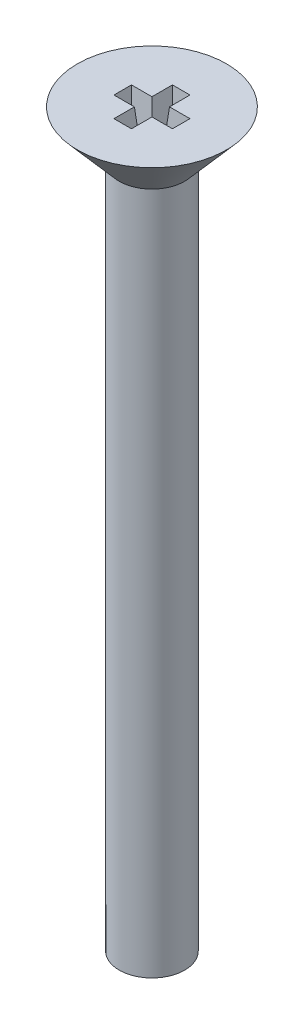
ISO-10303-21;
HEADER;
FILE_DESCRIPTION(('STEP AP214'),'2;1');
FILE_NAME('part.step','',(''),(''),'','','');
FILE_SCHEMA(('AUTOMOTIVE_DESIGN { 1 0 10303 214 1 1 1 1 }'));
ENDSEC;
DATA;
#1=APPLICATION_CONTEXT('core data for automotive mechanical design processes');
#2=APPLICATION_PROTOCOL_DEFINITION('international standard','automotive_design',2000,#1);
#3=PRODUCT_CONTEXT('',#1,'mechanical');
#4=PRODUCT('Part','Part','',(#3));
#5=PRODUCT_RELATED_PRODUCT_CATEGORY('part','',(#4));
#6=PRODUCT_DEFINITION_FORMATION('','',#4);
#7=PRODUCT_DEFINITION_CONTEXT('part definition',#1,'design');
#8=PRODUCT_DEFINITION('design','',#6,#7);
#9=PRODUCT_DEFINITION_SHAPE('','',#8);
#10=(LENGTH_UNIT() NAMED_UNIT(*) SI_UNIT(.MILLI.,.METRE.));
#11=(NAMED_UNIT(*) PLANE_ANGLE_UNIT() SI_UNIT($,.RADIAN.));
#12=(NAMED_UNIT(*) SI_UNIT($,.STERADIAN.) SOLID_ANGLE_UNIT());
#13=UNCERTAINTY_MEASURE_WITH_UNIT(LENGTH_MEASURE(1.E-05),#10,'distance_accuracy_value','');
#14=(GEOMETRIC_REPRESENTATION_CONTEXT(3) GLOBAL_UNCERTAINTY_ASSIGNED_CONTEXT((#13)) GLOBAL_UNIT_ASSIGNED_CONTEXT((#10,
#11,#12)) REPRESENTATION_CONTEXT('',''));
#15=CARTESIAN_POINT('',(0.,0.,0.));
#16=DIRECTION('',(0.,0.,1.));
#17=DIRECTION('',(1.,0.,0.));
#18=AXIS2_PLACEMENT_3D('',#15,#16,#17);
#19=CARTESIAN_POINT('',(0.,-29.6608159356459,0.));
#20=DIRECTION('',(0.,1.,0.));
#21=DIRECTION('',(-1.,0.,0.));
#22=AXIS2_PLACEMENT_3D('',#19,#20,#21);
#23=PLANE('',#22);
#24=CARTESIAN_POINT('',(0.,-29.6608159356459,0.));
#25=DIRECTION('',(0.,1.,0.));
#26=DIRECTION('',(-1.,0.,0.));
#27=AXIS2_PLACEMENT_3D('',#24,#25,#26);
#28=CIRCLE('',#27,1.4224);
#29=CARTESIAN_POINT('',(-1.4224,-29.6608159356459,0.));
#30=VERTEX_POINT('',#29);
#31=EDGE_CURVE('E11',#30,#30,#28,.T.);
#32=ORIENTED_EDGE('',*,*,#31,.F.);
#33=EDGE_LOOP('',(#32));
#34=FACE_BOUND('',#33,.T.);
#35=ADVANCED_FACE('F33',(#34),#23,.F.);
#36=CARTESIAN_POINT('',(0.,0.,0.));
#37=DIRECTION('',(0.,1.,0.));
#38=DIRECTION('',(-1.,0.,0.));
#39=AXIS2_PLACEMENT_3D('',#36,#37,#38);
#40=CYLINDRICAL_SURFACE('',#39,1.4224);
#41=CARTESIAN_POINT('',(0.,0.,0.));
#42=DIRECTION('',(0.,1.,0.));
#43=DIRECTION('',(-1.,0.,0.));
#44=AXIS2_PLACEMENT_3D('',#41,#42,#43);
#45=CIRCLE('',#44,1.4224);
#46=CARTESIAN_POINT('',(-1.4224,0.,0.));
#47=VERTEX_POINT('',#46);
#48=EDGE_CURVE('E40',#47,#47,#45,.T.);
#49=ORIENTED_EDGE('',*,*,#48,.F.);
#50=EDGE_LOOP('',(#49));
#51=FACE_BOUND('',#50,.T.);
#52=ORIENTED_EDGE('',*,*,#31,.T.);
#53=EDGE_LOOP('',(#52));
#54=FACE_BOUND('',#53,.T.);
#55=ADVANCED_FACE('F232',(#51,#54),#40,.T.);
#56=CARTESIAN_POINT('',(0.,0.,0.));
#57=DIRECTION('',(0.,1.,0.));
#58=DIRECTION('',(-1.,0.,0.));
#59=AXIS2_PLACEMENT_3D('',#56,#57,#58);
#60=CONICAL_SURFACE('',#59,1.4224,0.715584993317668);
#61=CARTESIAN_POINT('',(0.,2.0891840643541,0.));
#62=DIRECTION('',(0.,1.,0.));
#63=DIRECTION('',(-1.,0.,0.));
#64=AXIS2_PLACEMENT_3D('',#61,#62,#63);
#65=CIRCLE('',#64,3.23849999999999);
#66=CARTESIAN_POINT('',(-3.2385,2.08918406435409,0.));
#67=VERTEX_POINT('',#66);
#68=EDGE_CURVE('E176',#67,#67,#65,.T.);
#69=ORIENTED_EDGE('',*,*,#68,.F.);
#70=EDGE_LOOP('',(#69));
#71=FACE_BOUND('',#70,.T.);
#72=ORIENTED_EDGE('',*,*,#48,.T.);
#73=EDGE_LOOP('',(#72));
#74=FACE_BOUND('',#73,.T.);
#75=ADVANCED_FACE('F230',(#71,#74),#60,.T.);
#76=CARTESIAN_POINT('',(3.23849999999999,2.0891840643541,0.));
#77=DIRECTION('',(0.,-1.,0.));
#78=DIRECTION('',(1.,0.,0.));
#79=AXIS2_PLACEMENT_3D('',#76,#77,#78);
#80=PLANE('',#79);
#81=DIRECTION('',(-1.,0.,0.));
#82=VECTOR('',#81,1.);
#83=CARTESIAN_POINT('',(-0.381,2.0891840643541,-1.27));
#84=LINE('',#83,#82);
#85=CARTESIAN_POINT('',(0.380999999999999,2.0891840643541,-1.27));
#86=VERTEX_POINT('',#85);
#87=CARTESIAN_POINT('',(-0.381,2.0891840643541,-1.27));
#88=VERTEX_POINT('',#87);
#89=EDGE_CURVE('E139',#86,#88,#84,.T.);
#90=ORIENTED_EDGE('',*,*,#89,.F.);
#91=DIRECTION('',(0.,0.,-1.));
#92=VECTOR('',#91,1.);
#93=CARTESIAN_POINT('',(0.381,2.0891840643541,-1.27));
#94=LINE('',#93,#92);
#95=CARTESIAN_POINT('',(0.381,2.0891840643541,-0.381));
#96=VERTEX_POINT('',#95);
#97=EDGE_CURVE('E47',#96,#86,#94,.T.);
#98=ORIENTED_EDGE('',*,*,#97,.F.);
#99=DIRECTION('',(-1.,0.,0.));
#100=VECTOR('',#99,1.);
#101=CARTESIAN_POINT('',(0.381,2.0891840643541,-0.381));
#102=LINE('',#101,#100);
#103=CARTESIAN_POINT('',(1.27,2.0891840643541,-0.381));
#104=VERTEX_POINT('',#103);
#105=EDGE_CURVE('E172',#104,#96,#102,.T.);
#106=ORIENTED_EDGE('',*,*,#105,.F.);
#107=DIRECTION('',(0.,0.,-1.));
#108=VECTOR('',#107,1.);
#109=CARTESIAN_POINT('',(1.27,2.0891840643541,-0.381));
#110=LINE('',#109,#108);
#111=CARTESIAN_POINT('',(1.27,2.0891840643541,0.381));
#112=VERTEX_POINT('',#111);
#113=EDGE_CURVE('E170',#112,#104,#110,.T.);
#114=ORIENTED_EDGE('',*,*,#113,.F.);
#115=DIRECTION('',(1.,0.,0.));
#116=VECTOR('',#115,1.);
#117=CARTESIAN_POINT('',(1.27,2.0891840643541,0.381));
#118=LINE('',#117,#116);
#119=CARTESIAN_POINT('',(0.381,2.0891840643541,0.381));
#120=VERTEX_POINT('',#119);
#121=EDGE_CURVE('E167',#120,#112,#118,.T.);
#122=ORIENTED_EDGE('',*,*,#121,.F.);
#123=DIRECTION('',(0.,0.,-1.));
#124=VECTOR('',#123,1.);
#125=CARTESIAN_POINT('',(0.381,2.0891840643541,0.381));
#126=LINE('',#125,#124);
#127=CARTESIAN_POINT('',(0.381,2.0891840643541,1.27));
#128=VERTEX_POINT('',#127);
#129=EDGE_CURVE('E164',#128,#120,#126,.T.);
#130=ORIENTED_EDGE('',*,*,#129,.F.);
#131=DIRECTION('',(1.,0.,0.));
#132=VECTOR('',#131,1.);
#133=CARTESIAN_POINT('',(0.381,2.0891840643541,1.27));
#134=LINE('',#133,#132);
#135=CARTESIAN_POINT('',(-0.381,2.0891840643541,1.27));
#136=VERTEX_POINT('',#135);
#137=EDGE_CURVE('E161',#136,#128,#134,.T.);
#138=ORIENTED_EDGE('',*,*,#137,.F.);
#139=DIRECTION('',(0.,0.,1.));
#140=VECTOR('',#139,1.);
#141=CARTESIAN_POINT('',(-0.381,2.0891840643541,1.27));
#142=LINE('',#141,#140);
#143=CARTESIAN_POINT('',(-0.381,2.0891840643541,0.381));
#144=VERTEX_POINT('',#143);
#145=EDGE_CURVE('E158',#144,#136,#142,.T.);
#146=ORIENTED_EDGE('',*,*,#145,.F.);
#147=DIRECTION('',(1.,0.,0.));
#148=VECTOR('',#147,1.);
#149=CARTESIAN_POINT('',(-0.381,2.0891840643541,0.381));
#150=LINE('',#149,#148);
#151=CARTESIAN_POINT('',(-1.27,2.0891840643541,0.381));
#152=VERTEX_POINT('',#151);
#153=EDGE_CURVE('E155',#152,#144,#150,.T.);
#154=ORIENTED_EDGE('',*,*,#153,.F.);
#155=DIRECTION('',(0.,0.,1.));
#156=VECTOR('',#155,1.);
#157=CARTESIAN_POINT('',(-1.27,2.0891840643541,0.381));
#158=LINE('',#157,#156);
#159=CARTESIAN_POINT('',(-1.27,2.0891840643541,-0.381));
#160=VERTEX_POINT('',#159);
#161=EDGE_CURVE('E149',#160,#152,#158,.T.);
#162=ORIENTED_EDGE('',*,*,#161,.F.);
#163=DIRECTION('',(-1.,0.,0.));
#164=VECTOR('',#163,1.);
#165=CARTESIAN_POINT('',(-1.27,2.0891840643541,-0.381));
#166=LINE('',#165,#164);
#167=CARTESIAN_POINT('',(-0.381,2.0891840643541,-0.381));
#168=VERTEX_POINT('',#167);
#169=EDGE_CURVE('E147',#168,#160,#166,.T.);
#170=ORIENTED_EDGE('',*,*,#169,.F.);
#171=DIRECTION('',(0.,0.,1.));
#172=VECTOR('',#171,1.);
#173=CARTESIAN_POINT('',(-0.381,2.0891840643541,-0.381));
#174=LINE('',#173,#172);
#175=EDGE_CURVE('E130',#88,#168,#174,.T.);
#176=ORIENTED_EDGE('',*,*,#175,.F.);
#177=EDGE_LOOP('',(#90,#98,#106,#114,#122,#130,#138,#146,#154,#162,#170,#176));
#178=FACE_BOUND('',#177,.T.);
#179=ORIENTED_EDGE('',*,*,#68,.T.);
#180=EDGE_LOOP('',(#179));
#181=FACE_BOUND('',#180,.T.);
#182=ADVANCED_FACE('F143',(#178,#181),#80,.F.);
#183=CARTESIAN_POINT('',(0.381,2.0891840643541,-1.27));
#184=DIRECTION('',(0.996194698091746,-0.0871557427476581,0.));
#185=DIRECTION('',(0.0871557427476581,0.996194698091746,0.));
#186=AXIS2_PLACEMENT_3D('',#183,#184,#185);
#187=PLANE('',#186);
#188=ORIENTED_EDGE('',*,*,#97,.T.);
#189=DIRECTION('',(0.0868265938642475,0.992432509138967,-0.0868265938642476));
#190=VECTOR('',#189,1.);
#191=CARTESIAN_POINT('',(0.381,2.0891840643541,-1.27));
#192=LINE('',#191,#190);
#193=CARTESIAN_POINT('',(0.19211197544753,-0.0698159356459045,-1.08111197544753));
#194=VERTEX_POINT('',#193);
#195=EDGE_CURVE('E90',#194,#86,#192,.T.);
#196=ORIENTED_EDGE('',*,*,#195,.F.);
#197=DIRECTION('',(0.,0.,-1.));
#198=VECTOR('',#197,1.);
#199=CARTESIAN_POINT('',(0.19211197544753,-0.0698159356459045,0.));
#200=LINE('',#199,#198);
#201=CARTESIAN_POINT('',(0.19211197544753,-0.0698159356459045,-0.19211197544753));
#202=VERTEX_POINT('',#201);
#203=EDGE_CURVE('E174',#202,#194,#200,.T.);
#204=ORIENTED_EDGE('',*,*,#203,.F.);
#205=DIRECTION('',(0.0868265938642475,0.992432509138967,-0.0868265938642476));
#206=VECTOR('',#205,1.);
#207=CARTESIAN_POINT('',(0.387702044230437,2.16578878044342,-0.387702044230438));
#208=LINE('',#207,#206);
#209=EDGE_CURVE('E55',#202,#96,#208,.T.);
#210=ORIENTED_EDGE('',*,*,#209,.T.);
#211=EDGE_LOOP('',(#188,#196,#204,#210));
#212=FACE_BOUND('',#211,.T.);
#213=ADVANCED_FACE('F258',(#212),#187,.F.);
#214=CARTESIAN_POINT('',(0.381,2.0891840643541,-0.381));
#215=DIRECTION('',(0.,-0.0871557427476582,-0.996194698091745));
#216=DIRECTION('',(0.,0.996194698091746,-0.0871557427476582));
#217=AXIS2_PLACEMENT_3D('',#214,#215,#216);
#218=PLANE('',#217);
#219=ORIENTED_EDGE('',*,*,#105,.T.);
#220=ORIENTED_EDGE('',*,*,#209,.F.);
#221=DIRECTION('',(-1.,0.,0.));
#222=VECTOR('',#221,1.);
#223=CARTESIAN_POINT('',(0.,-0.0698159356459045,-0.19211197544753));
#224=LINE('',#223,#222);
#225=CARTESIAN_POINT('',(1.08111197544753,-0.0698159356459045,-0.19211197544753));
#226=VERTEX_POINT('',#225);
#227=EDGE_CURVE('E177',#226,#202,#224,.T.);
#228=ORIENTED_EDGE('',*,*,#227,.F.);
#229=DIRECTION('',(0.0868265938642475,0.992432509138967,-0.0868265938642476));
#230=VECTOR('',#229,1.);
#231=CARTESIAN_POINT('',(1.27,2.0891840643541,-0.381));
#232=LINE('',#231,#230);
#233=EDGE_CURVE('E95',#226,#104,#232,.T.);
#234=ORIENTED_EDGE('',*,*,#233,.T.);
#235=EDGE_LOOP('',(#219,#220,#228,#234));
#236=FACE_BOUND('',#235,.T.);
#237=ADVANCED_FACE('F267',(#236),#218,.F.);
#238=CARTESIAN_POINT('',(1.27,2.0891840643541,-0.381));
#239=DIRECTION('',(0.996194698091745,-0.0871557427476581,0.));
#240=DIRECTION('',(0.0871557427476581,0.996194698091746,0.));
#241=AXIS2_PLACEMENT_3D('',#238,#239,#240);
#242=PLANE('',#241);
#243=ORIENTED_EDGE('',*,*,#113,.T.);
#244=ORIENTED_EDGE('',*,*,#233,.F.);
#245=DIRECTION('',(0.,0.,-1.));
#246=VECTOR('',#245,1.);
#247=CARTESIAN_POINT('',(1.08111197544753,-0.0698159356459045,0.));
#248=LINE('',#247,#246);
#249=CARTESIAN_POINT('',(1.08111197544753,-0.0698159356459045,0.19211197544753));
#250=VERTEX_POINT('',#249);
#251=EDGE_CURVE('E200',#250,#226,#248,.T.);
#252=ORIENTED_EDGE('',*,*,#251,.F.);
#253=DIRECTION('',(0.0868265938642475,0.992432509138967,0.0868265938642476));
#254=VECTOR('',#253,1.);
#255=CARTESIAN_POINT('',(1.27,2.0891840643541,0.381));
#256=LINE('',#255,#254);
#257=EDGE_CURVE('E192',#250,#112,#256,.T.);
#258=ORIENTED_EDGE('',*,*,#257,.T.);
#259=EDGE_LOOP('',(#243,#244,#252,#258));
#260=FACE_BOUND('',#259,.T.);
#261=ADVANCED_FACE('F273',(#260),#242,.F.);
#262=CARTESIAN_POINT('',(1.27,2.0891840643541,0.381));
#263=DIRECTION('',(0.,-0.0871557427476582,0.996194698091746));
#264=DIRECTION('',(0.,-0.996194698091746,-0.0871557427476582));
#265=AXIS2_PLACEMENT_3D('',#262,#263,#264);
#266=PLANE('',#265);
#267=ORIENTED_EDGE('',*,*,#121,.T.);
#268=ORIENTED_EDGE('',*,*,#257,.F.);
#269=DIRECTION('',(1.,0.,0.));
#270=VECTOR('',#269,1.);
#271=CARTESIAN_POINT('',(0.,-0.0698159356459045,0.19211197544753));
#272=LINE('',#271,#270);
#273=CARTESIAN_POINT('',(0.19211197544753,-0.0698159356459045,0.19211197544753));
#274=VERTEX_POINT('',#273);
#275=EDGE_CURVE('E203',#274,#250,#272,.T.);
#276=ORIENTED_EDGE('',*,*,#275,.F.);
#277=DIRECTION('',(0.0868265938642475,0.992432509138967,0.0868265938642476));
#278=VECTOR('',#277,1.);
#279=CARTESIAN_POINT('',(0.387702044230437,2.16578878044342,0.387702044230438));
#280=LINE('',#279,#278);
#281=EDGE_CURVE('E190',#274,#120,#280,.T.);
#282=ORIENTED_EDGE('',*,*,#281,.T.);
#283=EDGE_LOOP('',(#267,#268,#276,#282));
#284=FACE_BOUND('',#283,.T.);
#285=ADVANCED_FACE('F280',(#284),#266,.F.);
#286=CARTESIAN_POINT('',(0.381,2.0891840643541,0.381));
#287=DIRECTION('',(0.996194698091746,-0.0871557427476581,0.));
#288=DIRECTION('',(0.0871557427476581,0.996194698091746,0.));
#289=AXIS2_PLACEMENT_3D('',#286,#287,#288);
#290=PLANE('',#289);
#291=ORIENTED_EDGE('',*,*,#129,.T.);
#292=ORIENTED_EDGE('',*,*,#281,.F.);
#293=DIRECTION('',(0.,0.,-1.));
#294=VECTOR('',#293,1.);
#295=CARTESIAN_POINT('',(0.19211197544753,-0.0698159356459045,0.));
#296=LINE('',#295,#294);
#297=CARTESIAN_POINT('',(0.19211197544753,-0.0698159356459045,1.08111197544753));
#298=VERTEX_POINT('',#297);
#299=EDGE_CURVE('E206',#298,#274,#296,.T.);
#300=ORIENTED_EDGE('',*,*,#299,.F.);
#301=DIRECTION('',(0.0868265938642475,0.992432509138967,0.0868265938642476));
#302=VECTOR('',#301,1.);
#303=CARTESIAN_POINT('',(0.381,2.0891840643541,1.27));
#304=LINE('',#303,#302);
#305=EDGE_CURVE('E188',#298,#128,#304,.T.);
#306=ORIENTED_EDGE('',*,*,#305,.T.);
#307=EDGE_LOOP('',(#291,#292,#300,#306));
#308=FACE_BOUND('',#307,.T.);
#309=ADVANCED_FACE('F288',(#308),#290,.F.);
#310=CARTESIAN_POINT('',(0.381,2.0891840643541,1.27));
#311=DIRECTION('',(0.,-0.0871557427476582,0.996194698091745));
#312=DIRECTION('',(0.,-0.996194698091746,-0.0871557427476582));
#313=AXIS2_PLACEMENT_3D('',#310,#311,#312);
#314=PLANE('',#313);
#315=ORIENTED_EDGE('',*,*,#137,.T.);
#316=ORIENTED_EDGE('',*,*,#305,.F.);
#317=DIRECTION('',(1.,0.,0.));
#318=VECTOR('',#317,1.);
#319=CARTESIAN_POINT('',(0.,-0.0698159356459045,1.08111197544753));
#320=LINE('',#319,#318);
#321=CARTESIAN_POINT('',(-0.19211197544753,-0.0698159356459045,1.08111197544753));
#322=VERTEX_POINT('',#321);
#323=EDGE_CURVE('E209',#322,#298,#320,.T.);
#324=ORIENTED_EDGE('',*,*,#323,.F.);
#325=DIRECTION('',(-0.0868265938642478,0.992432509138967,0.0868265938642476));
#326=VECTOR('',#325,1.);
#327=CARTESIAN_POINT('',(-0.381,2.0891840643541,1.27));
#328=LINE('',#327,#326);
#329=EDGE_CURVE('E186',#322,#136,#328,.T.);
#330=ORIENTED_EDGE('',*,*,#329,.T.);
#331=EDGE_LOOP('',(#315,#316,#324,#330));
#332=FACE_BOUND('',#331,.T.);
#333=ADVANCED_FACE('F296',(#332),#314,.F.);
#334=CARTESIAN_POINT('',(-0.381,2.0891840643541,1.27));
#335=DIRECTION('',(-0.996194698091746,-0.0871557427476583,0.));
#336=DIRECTION('',(0.0871557427476583,-0.996194698091746,0.));
#337=AXIS2_PLACEMENT_3D('',#334,#335,#336);
#338=PLANE('',#337);
#339=ORIENTED_EDGE('',*,*,#145,.T.);
#340=ORIENTED_EDGE('',*,*,#329,.F.);
#341=DIRECTION('',(0.,0.,1.));
#342=VECTOR('',#341,1.);
#343=CARTESIAN_POINT('',(-0.19211197544753,-0.0698159356459045,0.));
#344=LINE('',#343,#342);
#345=CARTESIAN_POINT('',(-0.19211197544753,-0.0698159356459045,0.19211197544753));
#346=VERTEX_POINT('',#345);
#347=EDGE_CURVE('E212',#346,#322,#344,.T.);
#348=ORIENTED_EDGE('',*,*,#347,.F.);
#349=DIRECTION('',(-0.0868265938642478,0.992432509138967,0.0868265938642476));
#350=VECTOR('',#349,1.);
#351=CARTESIAN_POINT('',(-0.387702044230438,2.16578878044342,0.387702044230438));
#352=LINE('',#351,#350);
#353=EDGE_CURVE('E184',#346,#144,#352,.T.);
#354=ORIENTED_EDGE('',*,*,#353,.T.);
#355=EDGE_LOOP('',(#339,#340,#348,#354));
#356=FACE_BOUND('',#355,.T.);
#357=ADVANCED_FACE('F304',(#356),#338,.F.);
#358=CARTESIAN_POINT('',(-0.381,2.0891840643541,0.381));
#359=DIRECTION('',(0.,-0.0871557427476582,0.996194698091745));
#360=DIRECTION('',(0.,-0.996194698091746,-0.0871557427476582));
#361=AXIS2_PLACEMENT_3D('',#358,#359,#360);
#362=PLANE('',#361);
#363=ORIENTED_EDGE('',*,*,#153,.T.);
#364=ORIENTED_EDGE('',*,*,#353,.F.);
#365=DIRECTION('',(1.,0.,0.));
#366=VECTOR('',#365,1.);
#367=CARTESIAN_POINT('',(0.,-0.0698159356459045,0.19211197544753));
#368=LINE('',#367,#366);
#369=CARTESIAN_POINT('',(-1.08111197544753,-0.0698159356459045,0.19211197544753));
#370=VERTEX_POINT('',#369);
#371=EDGE_CURVE('E215',#370,#346,#368,.T.);
#372=ORIENTED_EDGE('',*,*,#371,.F.);
#373=DIRECTION('',(-0.0868265938642478,0.992432509138967,0.0868265938642476));
#374=VECTOR('',#373,1.);
#375=CARTESIAN_POINT('',(-1.27,2.0891840643541,0.381));
#376=LINE('',#375,#374);
#377=EDGE_CURVE('E182',#370,#152,#376,.T.);
#378=ORIENTED_EDGE('',*,*,#377,.T.);
#379=EDGE_LOOP('',(#363,#364,#372,#378));
#380=FACE_BOUND('',#379,.T.);
#381=ADVANCED_FACE('F312',(#380),#362,.F.);
#382=CARTESIAN_POINT('',(-1.27,2.0891840643541,0.381));
#383=DIRECTION('',(-0.996194698091745,-0.0871557427476583,0.));
#384=DIRECTION('',(0.0871557427476583,-0.996194698091746,0.));
#385=AXIS2_PLACEMENT_3D('',#382,#383,#384);
#386=PLANE('',#385);
#387=ORIENTED_EDGE('',*,*,#161,.T.);
#388=ORIENTED_EDGE('',*,*,#377,.F.);
#389=DIRECTION('',(0.,0.,1.));
#390=VECTOR('',#389,1.);
#391=CARTESIAN_POINT('',(-1.08111197544753,-0.0698159356459045,0.));
#392=LINE('',#391,#390);
#393=CARTESIAN_POINT('',(-1.08111197544753,-0.0698159356459045,-0.19211197544753));
#394=VERTEX_POINT('',#393);
#395=EDGE_CURVE('E218',#394,#370,#392,.T.);
#396=ORIENTED_EDGE('',*,*,#395,.F.);
#397=DIRECTION('',(-0.0868265938642478,0.992432509138967,-0.0868265938642476));
#398=VECTOR('',#397,1.);
#399=CARTESIAN_POINT('',(-1.27,2.0891840643541,-0.381));
#400=LINE('',#399,#398);
#401=EDGE_CURVE('E180',#394,#160,#400,.T.);
#402=ORIENTED_EDGE('',*,*,#401,.T.);
#403=EDGE_LOOP('',(#387,#388,#396,#402));
#404=FACE_BOUND('',#403,.T.);
#405=ADVANCED_FACE('F320',(#404),#386,.F.);
#406=CARTESIAN_POINT('',(-1.27,2.0891840643541,-0.381));
#407=DIRECTION('',(0.,-0.0871557427476582,-0.996194698091746));
#408=DIRECTION('',(0.,0.996194698091746,-0.0871557427476582));
#409=AXIS2_PLACEMENT_3D('',#406,#407,#408);
#410=PLANE('',#409);
#411=ORIENTED_EDGE('',*,*,#169,.T.);
#412=ORIENTED_EDGE('',*,*,#401,.F.);
#413=DIRECTION('',(-1.,0.,0.));
#414=VECTOR('',#413,1.);
#415=CARTESIAN_POINT('',(0.,-0.0698159356459045,-0.19211197544753));
#416=LINE('',#415,#414);
#417=CARTESIAN_POINT('',(-0.19211197544753,-0.0698159356459045,-0.19211197544753));
#418=VERTEX_POINT('',#417);
#419=EDGE_CURVE('E221',#418,#394,#416,.T.);
#420=ORIENTED_EDGE('',*,*,#419,.F.);
#421=DIRECTION('',(-0.0868265938642478,0.992432509138967,-0.0868265938642476));
#422=VECTOR('',#421,1.);
#423=CARTESIAN_POINT('',(-0.387702044230438,2.16578878044342,-0.387702044230438));
#424=LINE('',#423,#422);
#425=EDGE_CURVE('E136',#418,#168,#424,.T.);
#426=ORIENTED_EDGE('',*,*,#425,.T.);
#427=EDGE_LOOP('',(#411,#412,#420,#426));
#428=FACE_BOUND('',#427,.T.);
#429=ADVANCED_FACE('F328',(#428),#410,.F.);
#430=CARTESIAN_POINT('',(-0.381,2.0891840643541,-0.381));
#431=DIRECTION('',(-0.996194698091746,-0.0871557427476583,0.));
#432=DIRECTION('',(0.0871557427476583,-0.996194698091746,0.));
#433=AXIS2_PLACEMENT_3D('',#430,#431,#432);
#434=PLANE('',#433);
#435=ORIENTED_EDGE('',*,*,#175,.T.);
#436=ORIENTED_EDGE('',*,*,#425,.F.);
#437=DIRECTION('',(0.,0.,1.));
#438=VECTOR('',#437,1.);
#439=CARTESIAN_POINT('',(-0.19211197544753,-0.0698159356459045,0.));
#440=LINE('',#439,#438);
#441=CARTESIAN_POINT('',(-0.19211197544753,-0.0698159356459045,-1.08111197544753));
#442=VERTEX_POINT('',#441);
#443=EDGE_CURVE('E133',#442,#418,#440,.T.);
#444=ORIENTED_EDGE('',*,*,#443,.F.);
#445=DIRECTION('',(-0.0868265938642478,0.992432509138967,-0.0868265938642476));
#446=VECTOR('',#445,1.);
#447=CARTESIAN_POINT('',(-0.381,2.0891840643541,-1.27));
#448=LINE('',#447,#446);
#449=EDGE_CURVE('E126',#442,#88,#448,.T.);
#450=ORIENTED_EDGE('',*,*,#449,.T.);
#451=EDGE_LOOP('',(#435,#436,#444,#450));
#452=FACE_BOUND('',#451,.T.);
#453=ADVANCED_FACE('F128',(#452),#434,.F.);
#454=CARTESIAN_POINT('',(-0.381,2.0891840643541,-1.27));
#455=DIRECTION('',(0.,-0.0871557427476582,-0.996194698091745));
#456=DIRECTION('',(0.,0.996194698091746,-0.0871557427476582));
#457=AXIS2_PLACEMENT_3D('',#454,#455,#456);
#458=PLANE('',#457);
#459=ORIENTED_EDGE('',*,*,#89,.T.);
#460=ORIENTED_EDGE('',*,*,#449,.F.);
#461=DIRECTION('',(-1.,0.,0.));
#462=VECTOR('',#461,1.);
#463=CARTESIAN_POINT('',(0.,-0.0698159356459045,-1.08111197544753));
#464=LINE('',#463,#462);
#465=EDGE_CURVE('E197',#194,#442,#464,.T.);
#466=ORIENTED_EDGE('',*,*,#465,.F.);
#467=ORIENTED_EDGE('',*,*,#195,.T.);
#468=EDGE_LOOP('',(#459,#460,#466,#467));
#469=FACE_BOUND('',#468,.T.);
#470=ADVANCED_FACE('F140',(#469),#458,.F.);
#471=CARTESIAN_POINT('',(0.,-0.0698159356459045,0.));
#472=DIRECTION('',(0.,1.,0.));
#473=DIRECTION('',(0.,0.,1.));
#474=AXIS2_PLACEMENT_3D('',#471,#472,#473);
#475=PLANE('',#474);
#476=ORIENTED_EDGE('',*,*,#203,.T.);
#477=ORIENTED_EDGE('',*,*,#465,.T.);
#478=ORIENTED_EDGE('',*,*,#443,.T.);
#479=ORIENTED_EDGE('',*,*,#419,.T.);
#480=ORIENTED_EDGE('',*,*,#395,.T.);
#481=ORIENTED_EDGE('',*,*,#371,.T.);
#482=ORIENTED_EDGE('',*,*,#347,.T.);
#483=ORIENTED_EDGE('',*,*,#323,.T.);
#484=ORIENTED_EDGE('',*,*,#299,.T.);
#485=ORIENTED_EDGE('',*,*,#275,.T.);
#486=ORIENTED_EDGE('',*,*,#251,.T.);
#487=ORIENTED_EDGE('',*,*,#227,.T.);
#488=EDGE_LOOP('',(#476,#477,#478,#479,#480,#481,#482,#483,#484,#485,#486,#487));
#489=FACE_BOUND('',#488,.T.);
#490=ADVANCED_FACE('F349',(#489),#475,.T.);
#491=CLOSED_SHELL('',(#35,#55,#75,#182,#213,#237,#261,#285,#309,#333,#357,#381,#405,#429,#453,
#470,#490));
#492=MANIFOLD_SOLID_BREP('B2',#491);
#493=ADVANCED_BREP_SHAPE_REPRESENTATION('',(#18,#492),#14);
#494=SHAPE_DEFINITION_REPRESENTATION(#9,#493);
ENDSEC;
END-ISO-10303-21;
